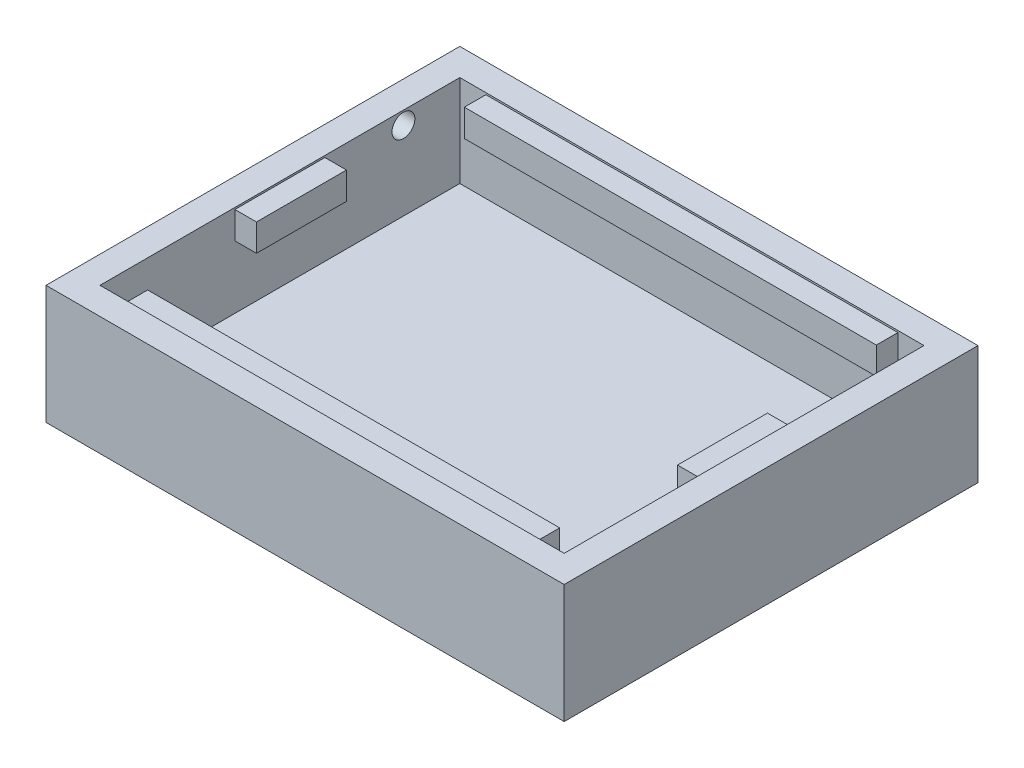
ISO-10303-21;
HEADER;
FILE_DESCRIPTION(('STEP AP214'),'2;1');
FILE_NAME('part.step','',(''),(''),'','','');
FILE_SCHEMA(('AUTOMOTIVE_DESIGN { 1 0 10303 214 1 1 1 1 }'));
ENDSEC;
DATA;
#1=APPLICATION_CONTEXT('core data for automotive mechanical design processes');
#2=APPLICATION_PROTOCOL_DEFINITION('international standard','automotive_design',2000,#1);
#3=PRODUCT_CONTEXT('',#1,'mechanical');
#4=PRODUCT('Part','Part','',(#3));
#5=PRODUCT_RELATED_PRODUCT_CATEGORY('part','',(#4));
#6=PRODUCT_DEFINITION_FORMATION('','',#4);
#7=PRODUCT_DEFINITION_CONTEXT('part definition',#1,'design');
#8=PRODUCT_DEFINITION('design','',#6,#7);
#9=PRODUCT_DEFINITION_SHAPE('','',#8);
#10=(LENGTH_UNIT() NAMED_UNIT(*) SI_UNIT(.MILLI.,.METRE.));
#11=(NAMED_UNIT(*) PLANE_ANGLE_UNIT() SI_UNIT($,.RADIAN.));
#12=(NAMED_UNIT(*) SI_UNIT($,.STERADIAN.) SOLID_ANGLE_UNIT());
#13=UNCERTAINTY_MEASURE_WITH_UNIT(LENGTH_MEASURE(1.E-05),#10,'distance_accuracy_value','');
#14=(GEOMETRIC_REPRESENTATION_CONTEXT(3) GLOBAL_UNCERTAINTY_ASSIGNED_CONTEXT((#13)) GLOBAL_UNIT_ASSIGNED_CONTEXT((#10,
#11,#12)) REPRESENTATION_CONTEXT('',''));
#15=CARTESIAN_POINT('',(0.,0.,0.));
#16=DIRECTION('',(0.,0.,1.));
#17=DIRECTION('',(1.,0.,0.));
#18=AXIS2_PLACEMENT_3D('',#15,#16,#17);
#19=CARTESIAN_POINT('',(0.,51.,0.));
#20=DIRECTION('',(1.,0.,0.));
#21=DIRECTION('',(0.,0.,-1.));
#22=AXIS2_PLACEMENT_3D('',#19,#20,#21);
#23=PLANE('',#22);
#24=CARTESIAN_POINT('',(0.,43.65,-168.65));
#25=DIRECTION('',(1.,0.,0.));
#26=DIRECTION('',(0.,0.,-1.));
#27=AXIS2_PLACEMENT_3D('',#24,#25,#26);
#28=CIRCLE('',#27,6.35);
#29=CARTESIAN_POINT('',(0.,43.65,-175.));
#30=VERTEX_POINT('',#29);
#31=EDGE_CURVE('E715',#30,#30,#28,.T.);
#32=ORIENTED_EDGE('',*,*,#31,.F.);
#33=EDGE_LOOP('',(#32));
#34=FACE_BOUND('',#33,.T.);
#35=DIRECTION('',(0.,0.,1.));
#36=VECTOR('',#35,1.);
#37=CARTESIAN_POINT('',(0.,0.,0.));
#38=LINE('',#37,#36);
#39=CARTESIAN_POINT('',(0.,0.,-200.));
#40=VERTEX_POINT('',#39);
#41=CARTESIAN_POINT('',(0.,0.,0.));
#42=VERTEX_POINT('',#41);
#43=EDGE_CURVE('E331',#40,#42,#38,.T.);
#44=ORIENTED_EDGE('',*,*,#43,.F.);
#45=DIRECTION('',(0.,-1.,0.));
#46=VECTOR('',#45,1.);
#47=CARTESIAN_POINT('',(0.,51.,-200.));
#48=LINE('',#47,#46);
#49=CARTESIAN_POINT('',(0.,51.,-200.));
#50=VERTEX_POINT('',#49);
#51=EDGE_CURVE('E342',#50,#40,#48,.T.);
#52=ORIENTED_EDGE('',*,*,#51,.F.);
#53=DIRECTION('',(0.,0.,1.));
#54=VECTOR('',#53,1.);
#55=CARTESIAN_POINT('',(0.,51.,0.));
#56=LINE('',#55,#54);
#57=CARTESIAN_POINT('',(0.,51.,0.));
#58=VERTEX_POINT('',#57);
#59=EDGE_CURVE('E332',#50,#58,#56,.T.);
#60=ORIENTED_EDGE('',*,*,#59,.T.);
#61=DIRECTION('',(0.,-1.,0.));
#62=VECTOR('',#61,1.);
#63=CARTESIAN_POINT('',(0.,51.,0.));
#64=LINE('',#63,#62);
#65=EDGE_CURVE('E360',#58,#42,#64,.T.);
#66=ORIENTED_EDGE('',*,*,#65,.T.);
#67=EDGE_LOOP('',(#44,#52,#60,#66));
#68=FACE_BOUND('',#67,.T.);
#69=DIRECTION('',(0.,0.,1.));
#70=VECTOR('',#69,1.);
#71=CARTESIAN_POINT('',(0.,50.,-125.));
#72=LINE('',#71,#70);
#73=CARTESIAN_POINT('',(0.,50.,-125.));
#74=VERTEX_POINT('',#73);
#75=CARTESIAN_POINT('',(0.,50.,-75.));
#76=VERTEX_POINT('',#75);
#77=EDGE_CURVE('E51',#74,#76,#72,.T.);
#78=ORIENTED_EDGE('',*,*,#77,.F.);
#79=DIRECTION('',(0.,1.,0.));
#80=VECTOR('',#79,1.);
#81=CARTESIAN_POINT('',(0.,50.,-125.));
#82=LINE('',#81,#80);
#83=CARTESIAN_POINT('',(0.,34.9,-125.));
#84=VERTEX_POINT('',#83);
#85=EDGE_CURVE('E56',#84,#74,#82,.T.);
#86=ORIENTED_EDGE('',*,*,#85,.F.);
#87=DIRECTION('',(0.,0.,1.));
#88=VECTOR('',#87,1.);
#89=CARTESIAN_POINT('',(0.,34.9,-125.));
#90=LINE('',#89,#88);
#91=CARTESIAN_POINT('',(0.,34.9,-75.));
#92=VERTEX_POINT('',#91);
#93=EDGE_CURVE('E215',#84,#92,#90,.T.);
#94=ORIENTED_EDGE('',*,*,#93,.T.);
#95=DIRECTION('',(0.,1.,0.));
#96=VECTOR('',#95,1.);
#97=CARTESIAN_POINT('',(0.,50.,-75.));
#98=LINE('',#97,#96);
#99=EDGE_CURVE('E219',#92,#76,#98,.T.);
#100=ORIENTED_EDGE('',*,*,#99,.T.);
#101=EDGE_LOOP('',(#78,#86,#94,#100));
#102=FACE_BOUND('',#101,.T.);
#103=ADVANCED_FACE('F36',(#34,#68,#102),#23,.T.);
#104=CARTESIAN_POINT('',(0.,51.,-200.));
#105=DIRECTION('',(0.,0.,1.));
#106=DIRECTION('',(1.,0.,0.));
#107=AXIS2_PLACEMENT_3D('',#104,#105,#106);
#108=PLANE('',#107);
#109=DIRECTION('',(-1.,0.,0.));
#110=VECTOR('',#109,1.);
#111=CARTESIAN_POINT('',(0.,0.,-200.));
#112=LINE('',#111,#110);
#113=CARTESIAN_POINT('',(258.,0.,-200.));
#114=VERTEX_POINT('',#113);
#115=EDGE_CURVE('E335',#114,#40,#112,.T.);
#116=ORIENTED_EDGE('',*,*,#115,.F.);
#117=DIRECTION('',(0.,-1.,0.));
#118=VECTOR('',#117,1.);
#119=CARTESIAN_POINT('',(258.,51.,-200.));
#120=LINE('',#119,#118);
#121=CARTESIAN_POINT('',(258.,51.,-200.));
#122=VERTEX_POINT('',#121);
#123=EDGE_CURVE('E355',#122,#114,#120,.T.);
#124=ORIENTED_EDGE('',*,*,#123,.F.);
#125=DIRECTION('',(-1.,0.,0.));
#126=VECTOR('',#125,1.);
#127=CARTESIAN_POINT('',(0.,51.,-200.));
#128=LINE('',#127,#126);
#129=EDGE_CURVE('E340',#122,#50,#128,.T.);
#130=ORIENTED_EDGE('',*,*,#129,.T.);
#131=ORIENTED_EDGE('',*,*,#51,.T.);
#132=EDGE_LOOP('',(#116,#124,#130,#131));
#133=FACE_BOUND('',#132,.T.);
#134=DIRECTION('',(-1.,0.,0.));
#135=VECTOR('',#134,1.);
#136=CARTESIAN_POINT('',(243.5,50.,-200.));
#137=LINE('',#136,#135);
#138=CARTESIAN_POINT('',(243.5,50.,-200.));
#139=VERTEX_POINT('',#138);
#140=CARTESIAN_POINT('',(14.4999999999999,50.,-200.));
#141=VERTEX_POINT('',#140);
#142=EDGE_CURVE('E287',#139,#141,#137,.T.);
#143=ORIENTED_EDGE('',*,*,#142,.F.);
#144=DIRECTION('',(0.,1.,0.));
#145=VECTOR('',#144,1.);
#146=CARTESIAN_POINT('',(243.5,50.,-200.));
#147=LINE('',#146,#145);
#148=CARTESIAN_POINT('',(243.5,34.9,-200.));
#149=VERTEX_POINT('',#148);
#150=EDGE_CURVE('E261',#149,#139,#147,.T.);
#151=ORIENTED_EDGE('',*,*,#150,.F.);
#152=DIRECTION('',(-1.,0.,0.));
#153=VECTOR('',#152,1.);
#154=CARTESIAN_POINT('',(243.5,34.9,-200.));
#155=LINE('',#154,#153);
#156=CARTESIAN_POINT('',(14.4999999999999,34.9,-200.));
#157=VERTEX_POINT('',#156);
#158=EDGE_CURVE('E272',#149,#157,#155,.T.);
#159=ORIENTED_EDGE('',*,*,#158,.T.);
#160=DIRECTION('',(0.,1.,0.));
#161=VECTOR('',#160,1.);
#162=CARTESIAN_POINT('',(14.4999999999999,50.,-200.));
#163=LINE('',#162,#161);
#164=EDGE_CURVE('E260',#157,#141,#163,.T.);
#165=ORIENTED_EDGE('',*,*,#164,.T.);
#166=EDGE_LOOP('',(#143,#151,#159,#165));
#167=FACE_BOUND('',#166,.T.);
#168=ADVANCED_FACE('F404',(#133,#167),#108,.T.);
#169=CARTESIAN_POINT('',(0.,51.,0.));
#170=DIRECTION('',(0.,-1.,0.));
#171=DIRECTION('',(0.,0.,-1.));
#172=AXIS2_PLACEMENT_3D('',#169,#170,#171);
#173=PLANE('',#172);
#174=DIRECTION('',(0.,0.,1.));
#175=VECTOR('',#174,1.);
#176=CARTESIAN_POINT('',(-15.,51.,15.));
#177=LINE('',#176,#175);
#178=CARTESIAN_POINT('',(-15.,51.,-215.));
#179=VERTEX_POINT('',#178);
#180=CARTESIAN_POINT('',(-15.,51.,15.));
#181=VERTEX_POINT('',#180);
#182=EDGE_CURVE('E363',#179,#181,#177,.T.);
#183=ORIENTED_EDGE('',*,*,#182,.T.);
#184=DIRECTION('',(1.,0.,0.));
#185=VECTOR('',#184,1.);
#186=CARTESIAN_POINT('',(-15.,51.,15.));
#187=LINE('',#186,#185);
#188=CARTESIAN_POINT('',(273.,51.,15.));
#189=VERTEX_POINT('',#188);
#190=EDGE_CURVE('E366',#181,#189,#187,.T.);
#191=ORIENTED_EDGE('',*,*,#190,.T.);
#192=DIRECTION('',(0.,0.,-1.));
#193=VECTOR('',#192,1.);
#194=CARTESIAN_POINT('',(273.,51.,15.));
#195=LINE('',#194,#193);
#196=CARTESIAN_POINT('',(273.,51.,-215.));
#197=VERTEX_POINT('',#196);
#198=EDGE_CURVE('E368',#189,#197,#195,.T.);
#199=ORIENTED_EDGE('',*,*,#198,.T.);
#200=DIRECTION('',(-1.,0.,0.));
#201=VECTOR('',#200,1.);
#202=CARTESIAN_POINT('',(-15.,51.,-215.));
#203=LINE('',#202,#201);
#204=EDGE_CURVE('E370',#197,#179,#203,.T.);
#205=ORIENTED_EDGE('',*,*,#204,.T.);
#206=EDGE_LOOP('',(#183,#191,#199,#205));
#207=FACE_BOUND('',#206,.T.);
#208=ORIENTED_EDGE('',*,*,#59,.F.);
#209=ORIENTED_EDGE('',*,*,#129,.F.);
#210=DIRECTION('',(0.,0.,-1.));
#211=VECTOR('',#210,1.);
#212=CARTESIAN_POINT('',(258.,51.,0.));
#213=LINE('',#212,#211);
#214=CARTESIAN_POINT('',(258.,51.,0.));
#215=VERTEX_POINT('',#214);
#216=EDGE_CURVE('E337',#215,#122,#213,.T.);
#217=ORIENTED_EDGE('',*,*,#216,.F.);
#218=DIRECTION('',(1.,0.,0.));
#219=VECTOR('',#218,1.);
#220=CARTESIAN_POINT('',(0.,51.,0.));
#221=LINE('',#220,#219);
#222=EDGE_CURVE('E334',#58,#215,#221,.T.);
#223=ORIENTED_EDGE('',*,*,#222,.F.);
#224=EDGE_LOOP('',(#208,#209,#217,#223));
#225=FACE_BOUND('',#224,.T.);
#226=ADVANCED_FACE('F395',(#207,#225),#173,.F.);
#227=CARTESIAN_POINT('',(-15.,51.,15.));
#228=DIRECTION('',(1.,0.,0.));
#229=DIRECTION('',(0.,0.,-1.));
#230=AXIS2_PLACEMENT_3D('',#227,#228,#229);
#231=PLANE('',#230);
#232=CARTESIAN_POINT('',(-15.,43.65,-168.65));
#233=DIRECTION('',(1.,0.,0.));
#234=DIRECTION('',(0.,0.,-1.));
#235=AXIS2_PLACEMENT_3D('',#232,#233,#234);
#236=CIRCLE('',#235,6.35);
#237=CARTESIAN_POINT('',(-15.,43.65,-175.));
#238=VERTEX_POINT('',#237);
#239=EDGE_CURVE('E221',#238,#238,#236,.F.);
#240=ORIENTED_EDGE('',*,*,#239,.F.);
#241=EDGE_LOOP('',(#240));
#242=FACE_BOUND('',#241,.T.);
#243=DIRECTION('',(0.,-1.,0.));
#244=VECTOR('',#243,1.);
#245=CARTESIAN_POINT('',(-15.,51.,-215.));
#246=LINE('',#245,#244);
#247=CARTESIAN_POINT('',(-15.,-15.,-215.));
#248=VERTEX_POINT('',#247);
#249=EDGE_CURVE('E372',#179,#248,#246,.T.);
#250=ORIENTED_EDGE('',*,*,#249,.T.);
#251=DIRECTION('',(0.,0.,-1.));
#252=VECTOR('',#251,1.);
#253=CARTESIAN_POINT('',(-15.,-15.,-215.));
#254=LINE('',#253,#252);
#255=CARTESIAN_POINT('',(-15.,-15.,15.));
#256=VERTEX_POINT('',#255);
#257=EDGE_CURVE('E325',#256,#248,#254,.T.);
#258=ORIENTED_EDGE('',*,*,#257,.F.);
#259=DIRECTION('',(0.,-1.,0.));
#260=VECTOR('',#259,1.);
#261=CARTESIAN_POINT('',(-15.,51.,15.));
#262=LINE('',#261,#260);
#263=EDGE_CURVE('E11',#181,#256,#262,.T.);
#264=ORIENTED_EDGE('',*,*,#263,.F.);
#265=ORIENTED_EDGE('',*,*,#182,.F.);
#266=EDGE_LOOP('',(#250,#258,#264,#265));
#267=FACE_BOUND('',#266,.T.);
#268=ADVANCED_FACE('F38',(#242,#267),#231,.F.);
#269=CARTESIAN_POINT('',(-15.,51.,15.));
#270=DIRECTION('',(0.,0.,-1.));
#271=DIRECTION('',(-1.,0.,0.));
#272=AXIS2_PLACEMENT_3D('',#269,#270,#271);
#273=PLANE('',#272);
#274=ORIENTED_EDGE('',*,*,#263,.T.);
#275=DIRECTION('',(-1.,0.,0.));
#276=VECTOR('',#275,1.);
#277=CARTESIAN_POINT('',(-15.,-15.,15.));
#278=LINE('',#277,#276);
#279=CARTESIAN_POINT('',(273.,-15.,15.));
#280=VERTEX_POINT('',#279);
#281=EDGE_CURVE('E322',#280,#256,#278,.T.);
#282=ORIENTED_EDGE('',*,*,#281,.F.);
#283=DIRECTION('',(0.,-1.,0.));
#284=VECTOR('',#283,1.);
#285=CARTESIAN_POINT('',(273.,51.,15.));
#286=LINE('',#285,#284);
#287=EDGE_CURVE('E44',#189,#280,#286,.T.);
#288=ORIENTED_EDGE('',*,*,#287,.F.);
#289=ORIENTED_EDGE('',*,*,#190,.F.);
#290=EDGE_LOOP('',(#274,#282,#288,#289));
#291=FACE_BOUND('',#290,.T.);
#292=ADVANCED_FACE('F383',(#291),#273,.F.);
#293=CARTESIAN_POINT('',(273.,51.,15.));
#294=DIRECTION('',(-1.,0.,0.));
#295=DIRECTION('',(0.,0.,1.));
#296=AXIS2_PLACEMENT_3D('',#293,#294,#295);
#297=PLANE('',#296);
#298=ORIENTED_EDGE('',*,*,#287,.T.);
#299=DIRECTION('',(0.,0.,1.));
#300=VECTOR('',#299,1.);
#301=CARTESIAN_POINT('',(273.,-15.,15.));
#302=LINE('',#301,#300);
#303=CARTESIAN_POINT('',(273.,-15.,-215.));
#304=VERTEX_POINT('',#303);
#305=EDGE_CURVE('E319',#304,#280,#302,.T.);
#306=ORIENTED_EDGE('',*,*,#305,.F.);
#307=DIRECTION('',(0.,-1.,0.));
#308=VECTOR('',#307,1.);
#309=CARTESIAN_POINT('',(273.,51.,-215.));
#310=LINE('',#309,#308);
#311=EDGE_CURVE('E374',#197,#304,#310,.T.);
#312=ORIENTED_EDGE('',*,*,#311,.F.);
#313=ORIENTED_EDGE('',*,*,#198,.F.);
#314=EDGE_LOOP('',(#298,#306,#312,#313));
#315=FACE_BOUND('',#314,.T.);
#316=ADVANCED_FACE('F380',(#315),#297,.F.);
#317=CARTESIAN_POINT('',(-15.,51.,-215.));
#318=DIRECTION('',(0.,0.,1.));
#319=DIRECTION('',(1.,0.,0.));
#320=AXIS2_PLACEMENT_3D('',#317,#318,#319);
#321=PLANE('',#320);
#322=ORIENTED_EDGE('',*,*,#311,.T.);
#323=DIRECTION('',(1.,0.,0.));
#324=VECTOR('',#323,1.);
#325=CARTESIAN_POINT('',(273.,-15.,-215.));
#326=LINE('',#325,#324);
#327=EDGE_CURVE('E328',#248,#304,#326,.T.);
#328=ORIENTED_EDGE('',*,*,#327,.F.);
#329=ORIENTED_EDGE('',*,*,#249,.F.);
#330=ORIENTED_EDGE('',*,*,#204,.F.);
#331=EDGE_LOOP('',(#322,#328,#329,#330));
#332=FACE_BOUND('',#331,.T.);
#333=ADVANCED_FACE('F391',(#332),#321,.F.);
#334=CARTESIAN_POINT('',(0.,51.,0.));
#335=DIRECTION('',(0.,0.,-1.));
#336=DIRECTION('',(-1.,0.,0.));
#337=AXIS2_PLACEMENT_3D('',#334,#335,#336);
#338=PLANE('',#337);
#339=DIRECTION('',(0.,-1.,0.));
#340=VECTOR('',#339,1.);
#341=CARTESIAN_POINT('',(243.5,50.,0.));
#342=LINE('',#341,#340);
#343=CARTESIAN_POINT('',(243.5,50.,0.));
#344=VERTEX_POINT('',#343);
#345=CARTESIAN_POINT('',(243.5,34.9,0.));
#346=VERTEX_POINT('',#345);
#347=EDGE_CURVE('E291',#344,#346,#342,.T.);
#348=ORIENTED_EDGE('',*,*,#347,.F.);
#349=DIRECTION('',(-1.,0.,0.));
#350=VECTOR('',#349,1.);
#351=CARTESIAN_POINT('',(243.5,50.,0.));
#352=LINE('',#351,#350);
#353=CARTESIAN_POINT('',(14.5,50.,0.));
#354=VERTEX_POINT('',#353);
#355=EDGE_CURVE('E301',#344,#354,#352,.T.);
#356=ORIENTED_EDGE('',*,*,#355,.T.);
#357=DIRECTION('',(0.,-1.,0.));
#358=VECTOR('',#357,1.);
#359=CARTESIAN_POINT('',(14.5,50.,0.));
#360=LINE('',#359,#358);
#361=CARTESIAN_POINT('',(14.5,34.9,0.));
#362=VERTEX_POINT('',#361);
#363=EDGE_CURVE('E290',#354,#362,#360,.T.);
#364=ORIENTED_EDGE('',*,*,#363,.T.);
#365=DIRECTION('',(-1.,0.,0.));
#366=VECTOR('',#365,1.);
#367=CARTESIAN_POINT('',(243.5,34.9,0.));
#368=LINE('',#367,#366);
#369=EDGE_CURVE('E317',#346,#362,#368,.T.);
#370=ORIENTED_EDGE('',*,*,#369,.F.);
#371=EDGE_LOOP('',(#348,#356,#364,#370));
#372=FACE_BOUND('',#371,.T.);
#373=DIRECTION('',(1.,0.,0.));
#374=VECTOR('',#373,1.);
#375=CARTESIAN_POINT('',(0.,0.,0.));
#376=LINE('',#375,#374);
#377=CARTESIAN_POINT('',(258.,0.,0.));
#378=VERTEX_POINT('',#377);
#379=EDGE_CURVE('E345',#42,#378,#376,.T.);
#380=ORIENTED_EDGE('',*,*,#379,.F.);
#381=ORIENTED_EDGE('',*,*,#65,.F.);
#382=ORIENTED_EDGE('',*,*,#222,.T.);
#383=DIRECTION('',(0.,-1.,0.));
#384=VECTOR('',#383,1.);
#385=CARTESIAN_POINT('',(258.,51.,0.));
#386=LINE('',#385,#384);
#387=EDGE_CURVE('E358',#215,#378,#386,.T.);
#388=ORIENTED_EDGE('',*,*,#387,.T.);
#389=EDGE_LOOP('',(#380,#381,#382,#388));
#390=FACE_BOUND('',#389,.T.);
#391=ADVANCED_FACE('F418',(#372,#390),#338,.T.);
#392=CARTESIAN_POINT('',(258.,51.,0.));
#393=DIRECTION('',(-1.,0.,0.));
#394=DIRECTION('',(0.,0.,1.));
#395=AXIS2_PLACEMENT_3D('',#392,#393,#394);
#396=PLANE('',#395);
#397=DIRECTION('',(0.,-1.,0.));
#398=VECTOR('',#397,1.);
#399=CARTESIAN_POINT('',(258.,50.,-125.));
#400=LINE('',#399,#398);
#401=CARTESIAN_POINT('',(258.,50.,-125.));
#402=VERTEX_POINT('',#401);
#403=CARTESIAN_POINT('',(258.,34.9,-125.));
#404=VERTEX_POINT('',#403);
#405=EDGE_CURVE('E232',#402,#404,#400,.T.);
#406=ORIENTED_EDGE('',*,*,#405,.F.);
#407=DIRECTION('',(0.,0.,1.));
#408=VECTOR('',#407,1.);
#409=CARTESIAN_POINT('',(258.,50.,-125.));
#410=LINE('',#409,#408);
#411=CARTESIAN_POINT('',(258.,50.,-75.));
#412=VERTEX_POINT('',#411);
#413=EDGE_CURVE('E242',#402,#412,#410,.T.);
#414=ORIENTED_EDGE('',*,*,#413,.T.);
#415=DIRECTION('',(0.,-1.,0.));
#416=VECTOR('',#415,1.);
#417=CARTESIAN_POINT('',(258.,50.,-75.));
#418=LINE('',#417,#416);
#419=CARTESIAN_POINT('',(258.,34.9,-75.));
#420=VERTEX_POINT('',#419);
#421=EDGE_CURVE('E231',#412,#420,#418,.T.);
#422=ORIENTED_EDGE('',*,*,#421,.T.);
#423=DIRECTION('',(0.,0.,1.));
#424=VECTOR('',#423,1.);
#425=CARTESIAN_POINT('',(258.,34.9,-125.));
#426=LINE('',#425,#424);
#427=EDGE_CURVE('E258',#404,#420,#426,.T.);
#428=ORIENTED_EDGE('',*,*,#427,.F.);
#429=EDGE_LOOP('',(#406,#414,#422,#428));
#430=FACE_BOUND('',#429,.T.);
#431=DIRECTION('',(0.,0.,-1.));
#432=VECTOR('',#431,1.);
#433=CARTESIAN_POINT('',(258.,0.,0.));
#434=LINE('',#433,#432);
#435=EDGE_CURVE('E348',#378,#114,#434,.T.);
#436=ORIENTED_EDGE('',*,*,#435,.F.);
#437=ORIENTED_EDGE('',*,*,#387,.F.);
#438=ORIENTED_EDGE('',*,*,#216,.T.);
#439=ORIENTED_EDGE('',*,*,#123,.T.);
#440=EDGE_LOOP('',(#436,#437,#438,#439));
#441=FACE_BOUND('',#440,.T.);
#442=ADVANCED_FACE('F439',(#430,#441),#396,.T.);
#443=CARTESIAN_POINT('',(0.,0.,0.));
#444=DIRECTION('',(0.,1.,0.));
#445=DIRECTION('',(0.,0.,1.));
#446=AXIS2_PLACEMENT_3D('',#443,#444,#445);
#447=PLANE('',#446);
#448=ORIENTED_EDGE('',*,*,#435,.T.);
#449=ORIENTED_EDGE('',*,*,#115,.T.);
#450=ORIENTED_EDGE('',*,*,#43,.T.);
#451=ORIENTED_EDGE('',*,*,#379,.T.);
#452=EDGE_LOOP('',(#448,#449,#450,#451));
#453=FACE_BOUND('',#452,.T.);
#454=ADVANCED_FACE('F448',(#453),#447,.T.);
#455=CARTESIAN_POINT('',(0.,-15.,0.));
#456=DIRECTION('',(0.,1.,0.));
#457=DIRECTION('',(0.,0.,1.));
#458=AXIS2_PLACEMENT_3D('',#455,#456,#457);
#459=PLANE('',#458);
#460=ORIENTED_EDGE('',*,*,#305,.T.);
#461=ORIENTED_EDGE('',*,*,#281,.T.);
#462=ORIENTED_EDGE('',*,*,#257,.T.);
#463=ORIENTED_EDGE('',*,*,#327,.T.);
#464=EDGE_LOOP('',(#460,#461,#462,#463));
#465=FACE_BOUND('',#464,.T.);
#466=ADVANCED_FACE('F387',(#465),#459,.F.);
#467=CARTESIAN_POINT('',(243.5,34.9,0.));
#468=DIRECTION('',(0.,1.,0.));
#469=DIRECTION('',(0.,0.,1.));
#470=AXIS2_PLACEMENT_3D('',#467,#468,#469);
#471=PLANE('',#470);
#472=DIRECTION('',(0.,0.,-1.));
#473=VECTOR('',#472,1.);
#474=CARTESIAN_POINT('',(14.5,34.9,0.));
#475=LINE('',#474,#473);
#476=CARTESIAN_POINT('',(14.5,34.9,-12.));
#477=VERTEX_POINT('',#476);
#478=EDGE_CURVE('E304',#362,#477,#475,.T.);
#479=ORIENTED_EDGE('',*,*,#478,.T.);
#480=DIRECTION('',(-1.,0.,0.));
#481=VECTOR('',#480,1.);
#482=CARTESIAN_POINT('',(243.5,34.9,-12.0000000000001));
#483=LINE('',#482,#481);
#484=CARTESIAN_POINT('',(243.5,34.9,-12.0000000000001));
#485=VERTEX_POINT('',#484);
#486=EDGE_CURVE('E314',#485,#477,#483,.T.);
#487=ORIENTED_EDGE('',*,*,#486,.F.);
#488=DIRECTION('',(0.,0.,-1.));
#489=VECTOR('',#488,1.);
#490=CARTESIAN_POINT('',(243.5,34.9,0.));
#491=LINE('',#490,#489);
#492=EDGE_CURVE('E294',#346,#485,#491,.T.);
#493=ORIENTED_EDGE('',*,*,#492,.F.);
#494=ORIENTED_EDGE('',*,*,#369,.T.);
#495=EDGE_LOOP('',(#479,#487,#493,#494));
#496=FACE_BOUND('',#495,.T.);
#497=ADVANCED_FACE('F463',(#496),#471,.F.);
#498=CARTESIAN_POINT('',(243.5,50.,-12.0000000000001));
#499=DIRECTION('',(0.,0.,1.));
#500=DIRECTION('',(0.,-1.,0.));
#501=AXIS2_PLACEMENT_3D('',#498,#499,#500);
#502=PLANE('',#501);
#503=DIRECTION('',(0.,1.,0.));
#504=VECTOR('',#503,1.);
#505=CARTESIAN_POINT('',(14.5,50.,-12.));
#506=LINE('',#505,#504);
#507=CARTESIAN_POINT('',(14.5,50.,-12.));
#508=VERTEX_POINT('',#507);
#509=EDGE_CURVE('E306',#477,#508,#506,.T.);
#510=ORIENTED_EDGE('',*,*,#509,.T.);
#511=DIRECTION('',(-1.,0.,0.));
#512=VECTOR('',#511,1.);
#513=CARTESIAN_POINT('',(243.5,50.,-12.0000000000001));
#514=LINE('',#513,#512);
#515=CARTESIAN_POINT('',(243.5,50.,-12.0000000000001));
#516=VERTEX_POINT('',#515);
#517=EDGE_CURVE('E311',#516,#508,#514,.T.);
#518=ORIENTED_EDGE('',*,*,#517,.F.);
#519=DIRECTION('',(0.,1.,0.));
#520=VECTOR('',#519,1.);
#521=CARTESIAN_POINT('',(243.5,50.,-12.0000000000001));
#522=LINE('',#521,#520);
#523=EDGE_CURVE('E297',#485,#516,#522,.T.);
#524=ORIENTED_EDGE('',*,*,#523,.F.);
#525=ORIENTED_EDGE('',*,*,#486,.T.);
#526=EDGE_LOOP('',(#510,#518,#524,#525));
#527=FACE_BOUND('',#526,.T.);
#528=ADVANCED_FACE('F469',(#527),#502,.F.);
#529=CARTESIAN_POINT('',(243.5,50.,0.));
#530=DIRECTION('',(0.,-1.,0.));
#531=DIRECTION('',(0.,0.,-1.));
#532=AXIS2_PLACEMENT_3D('',#529,#530,#531);
#533=PLANE('',#532);
#534=DIRECTION('',(0.,0.,1.));
#535=VECTOR('',#534,1.);
#536=CARTESIAN_POINT('',(14.5,50.,0.));
#537=LINE('',#536,#535);
#538=EDGE_CURVE('E295',#508,#354,#537,.T.);
#539=ORIENTED_EDGE('',*,*,#538,.T.);
#540=ORIENTED_EDGE('',*,*,#355,.F.);
#541=DIRECTION('',(0.,0.,1.));
#542=VECTOR('',#541,1.);
#543=CARTESIAN_POINT('',(243.5,50.,0.));
#544=LINE('',#543,#542);
#545=EDGE_CURVE('E299',#516,#344,#544,.T.);
#546=ORIENTED_EDGE('',*,*,#545,.F.);
#547=ORIENTED_EDGE('',*,*,#517,.T.);
#548=EDGE_LOOP('',(#539,#540,#546,#547));
#549=FACE_BOUND('',#548,.T.);
#550=ADVANCED_FACE('F477',(#549),#533,.F.);
#551=CARTESIAN_POINT('',(243.5,0.,0.));
#552=DIRECTION('',(1.,0.,0.));
#553=DIRECTION('',(0.,0.,-1.));
#554=AXIS2_PLACEMENT_3D('',#551,#552,#553);
#555=PLANE('',#554);
#556=ORIENTED_EDGE('',*,*,#347,.T.);
#557=ORIENTED_EDGE('',*,*,#492,.T.);
#558=ORIENTED_EDGE('',*,*,#523,.T.);
#559=ORIENTED_EDGE('',*,*,#545,.T.);
#560=EDGE_LOOP('',(#556,#557,#558,#559));
#561=FACE_BOUND('',#560,.T.);
#562=ADVANCED_FACE('F485',(#561),#555,.T.);
#563=CARTESIAN_POINT('',(14.5,0.,0.));
#564=DIRECTION('',(1.,0.,0.));
#565=DIRECTION('',(0.,0.,-1.));
#566=AXIS2_PLACEMENT_3D('',#563,#564,#565);
#567=PLANE('',#566);
#568=ORIENTED_EDGE('',*,*,#363,.F.);
#569=ORIENTED_EDGE('',*,*,#538,.F.);
#570=ORIENTED_EDGE('',*,*,#509,.F.);
#571=ORIENTED_EDGE('',*,*,#478,.F.);
#572=EDGE_LOOP('',(#568,#569,#570,#571));
#573=FACE_BOUND('',#572,.T.);
#574=ADVANCED_FACE('F493',(#573),#567,.F.);
#575=CARTESIAN_POINT('',(243.5,50.,-200.));
#576=DIRECTION('',(0.,-1.,0.));
#577=DIRECTION('',(0.,0.,-1.));
#578=AXIS2_PLACEMENT_3D('',#575,#576,#577);
#579=PLANE('',#578);
#580=DIRECTION('',(0.,0.,1.));
#581=VECTOR('',#580,1.);
#582=CARTESIAN_POINT('',(14.4999999999999,50.,-200.));
#583=LINE('',#582,#581);
#584=CARTESIAN_POINT('',(14.4999999999999,50.,-188.));
#585=VERTEX_POINT('',#584);
#586=EDGE_CURVE('E274',#141,#585,#583,.T.);
#587=ORIENTED_EDGE('',*,*,#586,.T.);
#588=DIRECTION('',(-1.,0.,0.));
#589=VECTOR('',#588,1.);
#590=CARTESIAN_POINT('',(243.5,50.,-188.));
#591=LINE('',#590,#589);
#592=CARTESIAN_POINT('',(243.5,50.,-188.));
#593=VERTEX_POINT('',#592);
#594=EDGE_CURVE('E284',#593,#585,#591,.T.);
#595=ORIENTED_EDGE('',*,*,#594,.F.);
#596=DIRECTION('',(0.,0.,1.));
#597=VECTOR('',#596,1.);
#598=CARTESIAN_POINT('',(243.5,50.,-200.));
#599=LINE('',#598,#597);
#600=EDGE_CURVE('E264',#139,#593,#599,.T.);
#601=ORIENTED_EDGE('',*,*,#600,.F.);
#602=ORIENTED_EDGE('',*,*,#142,.T.);
#603=EDGE_LOOP('',(#587,#595,#601,#602));
#604=FACE_BOUND('',#603,.T.);
#605=ADVANCED_FACE('F501',(#604),#579,.F.);
#606=CARTESIAN_POINT('',(243.5,50.,-188.));
#607=DIRECTION('',(0.,0.,-1.));
#608=DIRECTION('',(-1.,0.,0.));
#609=AXIS2_PLACEMENT_3D('',#606,#607,#608);
#610=PLANE('',#609);
#611=DIRECTION('',(0.,-1.,0.));
#612=VECTOR('',#611,1.);
#613=CARTESIAN_POINT('',(14.4999999999999,50.,-188.));
#614=LINE('',#613,#612);
#615=CARTESIAN_POINT('',(14.4999999999999,34.9,-188.));
#616=VERTEX_POINT('',#615);
#617=EDGE_CURVE('E276',#585,#616,#614,.T.);
#618=ORIENTED_EDGE('',*,*,#617,.T.);
#619=DIRECTION('',(-1.,0.,0.));
#620=VECTOR('',#619,1.);
#621=CARTESIAN_POINT('',(243.5,34.9,-188.));
#622=LINE('',#621,#620);
#623=CARTESIAN_POINT('',(243.5,34.9,-188.));
#624=VERTEX_POINT('',#623);
#625=EDGE_CURVE('E281',#624,#616,#622,.T.);
#626=ORIENTED_EDGE('',*,*,#625,.F.);
#627=DIRECTION('',(0.,-1.,0.));
#628=VECTOR('',#627,1.);
#629=CARTESIAN_POINT('',(243.5,50.,-188.));
#630=LINE('',#629,#628);
#631=EDGE_CURVE('E267',#593,#624,#630,.T.);
#632=ORIENTED_EDGE('',*,*,#631,.F.);
#633=ORIENTED_EDGE('',*,*,#594,.T.);
#634=EDGE_LOOP('',(#618,#626,#632,#633));
#635=FACE_BOUND('',#634,.T.);
#636=ADVANCED_FACE('F509',(#635),#610,.F.);
#637=CARTESIAN_POINT('',(243.5,34.9,-200.));
#638=DIRECTION('',(0.,1.,0.));
#639=DIRECTION('',(0.,0.,1.));
#640=AXIS2_PLACEMENT_3D('',#637,#638,#639);
#641=PLANE('',#640);
#642=DIRECTION('',(0.,0.,-1.));
#643=VECTOR('',#642,1.);
#644=CARTESIAN_POINT('',(14.4999999999999,34.9,-200.));
#645=LINE('',#644,#643);
#646=EDGE_CURVE('E265',#616,#157,#645,.T.);
#647=ORIENTED_EDGE('',*,*,#646,.T.);
#648=ORIENTED_EDGE('',*,*,#158,.F.);
#649=DIRECTION('',(0.,0.,-1.));
#650=VECTOR('',#649,1.);
#651=CARTESIAN_POINT('',(243.5,34.9,-200.));
#652=LINE('',#651,#650);
#653=EDGE_CURVE('E269',#624,#149,#652,.T.);
#654=ORIENTED_EDGE('',*,*,#653,.F.);
#655=ORIENTED_EDGE('',*,*,#625,.T.);
#656=EDGE_LOOP('',(#647,#648,#654,#655));
#657=FACE_BOUND('',#656,.T.);
#658=ADVANCED_FACE('F517',(#657),#641,.F.);
#659=CARTESIAN_POINT('',(243.5,0.,0.));
#660=DIRECTION('',(-1.,0.,0.));
#661=DIRECTION('',(0.,0.,1.));
#662=AXIS2_PLACEMENT_3D('',#659,#660,#661);
#663=PLANE('',#662);
#664=ORIENTED_EDGE('',*,*,#150,.T.);
#665=ORIENTED_EDGE('',*,*,#600,.T.);
#666=ORIENTED_EDGE('',*,*,#631,.T.);
#667=ORIENTED_EDGE('',*,*,#653,.T.);
#668=EDGE_LOOP('',(#664,#665,#666,#667));
#669=FACE_BOUND('',#668,.T.);
#670=ADVANCED_FACE('F525',(#669),#663,.F.);
#671=CARTESIAN_POINT('',(14.4999999999999,0.,0.));
#672=DIRECTION('',(-1.,0.,0.));
#673=DIRECTION('',(0.,0.,1.));
#674=AXIS2_PLACEMENT_3D('',#671,#672,#673);
#675=PLANE('',#674);
#676=ORIENTED_EDGE('',*,*,#164,.F.);
#677=ORIENTED_EDGE('',*,*,#646,.F.);
#678=ORIENTED_EDGE('',*,*,#617,.F.);
#679=ORIENTED_EDGE('',*,*,#586,.F.);
#680=EDGE_LOOP('',(#676,#677,#678,#679));
#681=FACE_BOUND('',#680,.T.);
#682=ADVANCED_FACE('F533',(#681),#675,.T.);
#683=CARTESIAN_POINT('',(258.,34.9,-125.));
#684=DIRECTION('',(0.,1.,0.));
#685=DIRECTION('',(0.,0.,1.));
#686=AXIS2_PLACEMENT_3D('',#683,#684,#685);
#687=PLANE('',#686);
#688=DIRECTION('',(-1.,0.,0.));
#689=VECTOR('',#688,1.);
#690=CARTESIAN_POINT('',(258.,34.9,-75.));
#691=LINE('',#690,#689);
#692=CARTESIAN_POINT('',(246.,34.9,-75.));
#693=VERTEX_POINT('',#692);
#694=EDGE_CURVE('E245',#420,#693,#691,.T.);
#695=ORIENTED_EDGE('',*,*,#694,.T.);
#696=DIRECTION('',(0.,0.,1.));
#697=VECTOR('',#696,1.);
#698=CARTESIAN_POINT('',(246.,34.9,-125.));
#699=LINE('',#698,#697);
#700=CARTESIAN_POINT('',(246.,34.9,-125.));
#701=VERTEX_POINT('',#700);
#702=EDGE_CURVE('E255',#701,#693,#699,.T.);
#703=ORIENTED_EDGE('',*,*,#702,.F.);
#704=DIRECTION('',(-1.,0.,0.));
#705=VECTOR('',#704,1.);
#706=CARTESIAN_POINT('',(258.,34.9,-125.));
#707=LINE('',#706,#705);
#708=EDGE_CURVE('E235',#404,#701,#707,.T.);
#709=ORIENTED_EDGE('',*,*,#708,.F.);
#710=ORIENTED_EDGE('',*,*,#427,.T.);
#711=EDGE_LOOP('',(#695,#703,#709,#710));
#712=FACE_BOUND('',#711,.T.);
#713=ADVANCED_FACE('F540',(#712),#687,.F.);
#714=CARTESIAN_POINT('',(246.,50.,-125.));
#715=DIRECTION('',(1.,0.,0.));
#716=DIRECTION('',(0.,1.,0.));
#717=AXIS2_PLACEMENT_3D('',#714,#715,#716);
#718=PLANE('',#717);
#719=DIRECTION('',(0.,1.,0.));
#720=VECTOR('',#719,1.);
#721=CARTESIAN_POINT('',(246.,50.,-75.));
#722=LINE('',#721,#720);
#723=CARTESIAN_POINT('',(246.,50.,-75.));
#724=VERTEX_POINT('',#723);
#725=EDGE_CURVE('E247',#693,#724,#722,.T.);
#726=ORIENTED_EDGE('',*,*,#725,.T.);
#727=DIRECTION('',(0.,0.,1.));
#728=VECTOR('',#727,1.);
#729=CARTESIAN_POINT('',(246.,50.,-125.));
#730=LINE('',#729,#728);
#731=CARTESIAN_POINT('',(246.,50.,-125.));
#732=VERTEX_POINT('',#731);
#733=EDGE_CURVE('E252',#732,#724,#730,.T.);
#734=ORIENTED_EDGE('',*,*,#733,.F.);
#735=DIRECTION('',(0.,1.,0.));
#736=VECTOR('',#735,1.);
#737=CARTESIAN_POINT('',(246.,50.,-125.));
#738=LINE('',#737,#736);
#739=EDGE_CURVE('E238',#701,#732,#738,.T.);
#740=ORIENTED_EDGE('',*,*,#739,.F.);
#741=ORIENTED_EDGE('',*,*,#702,.T.);
#742=EDGE_LOOP('',(#726,#734,#740,#741));
#743=FACE_BOUND('',#742,.T.);
#744=ADVANCED_FACE('F547',(#743),#718,.F.);
#745=CARTESIAN_POINT('',(258.,50.,-125.));
#746=DIRECTION('',(0.,-1.,0.));
#747=DIRECTION('',(0.,0.,-1.));
#748=AXIS2_PLACEMENT_3D('',#745,#746,#747);
#749=PLANE('',#748);
#750=DIRECTION('',(1.,0.,0.));
#751=VECTOR('',#750,1.);
#752=CARTESIAN_POINT('',(258.,50.,-75.));
#753=LINE('',#752,#751);
#754=EDGE_CURVE('E236',#724,#412,#753,.T.);
#755=ORIENTED_EDGE('',*,*,#754,.T.);
#756=ORIENTED_EDGE('',*,*,#413,.F.);
#757=DIRECTION('',(1.,0.,0.));
#758=VECTOR('',#757,1.);
#759=CARTESIAN_POINT('',(258.,50.,-125.));
#760=LINE('',#759,#758);
#761=EDGE_CURVE('E240',#732,#402,#760,.T.);
#762=ORIENTED_EDGE('',*,*,#761,.F.);
#763=ORIENTED_EDGE('',*,*,#733,.T.);
#764=EDGE_LOOP('',(#755,#756,#762,#763));
#765=FACE_BOUND('',#764,.T.);
#766=ADVANCED_FACE('F555',(#765),#749,.F.);
#767=CARTESIAN_POINT('',(0.,0.,-125.));
#768=DIRECTION('',(0.,0.,-1.));
#769=DIRECTION('',(-1.,0.,0.));
#770=AXIS2_PLACEMENT_3D('',#767,#768,#769);
#771=PLANE('',#770);
#772=ORIENTED_EDGE('',*,*,#405,.T.);
#773=ORIENTED_EDGE('',*,*,#708,.T.);
#774=ORIENTED_EDGE('',*,*,#739,.T.);
#775=ORIENTED_EDGE('',*,*,#761,.T.);
#776=EDGE_LOOP('',(#772,#773,#774,#775));
#777=FACE_BOUND('',#776,.T.);
#778=ADVANCED_FACE('F563',(#777),#771,.T.);
#779=CARTESIAN_POINT('',(0.,0.,-75.));
#780=DIRECTION('',(0.,0.,-1.));
#781=DIRECTION('',(-1.,0.,0.));
#782=AXIS2_PLACEMENT_3D('',#779,#780,#781);
#783=PLANE('',#782);
#784=ORIENTED_EDGE('',*,*,#421,.F.);
#785=ORIENTED_EDGE('',*,*,#754,.F.);
#786=ORIENTED_EDGE('',*,*,#725,.F.);
#787=ORIENTED_EDGE('',*,*,#694,.F.);
#788=EDGE_LOOP('',(#784,#785,#786,#787));
#789=FACE_BOUND('',#788,.T.);
#790=ADVANCED_FACE('F571',(#789),#783,.F.);
#791=CARTESIAN_POINT('',(0.,50.,-125.));
#792=DIRECTION('',(0.,-1.,0.));
#793=DIRECTION('',(0.,0.,-1.));
#794=AXIS2_PLACEMENT_3D('',#791,#792,#793);
#795=PLANE('',#794);
#796=DIRECTION('',(1.,0.,0.));
#797=VECTOR('',#796,1.);
#798=CARTESIAN_POINT('',(0.,50.,-75.));
#799=LINE('',#798,#797);
#800=CARTESIAN_POINT('',(12.,50.,-75.));
#801=VERTEX_POINT('',#800);
#802=EDGE_CURVE('E205',#76,#801,#799,.T.);
#803=ORIENTED_EDGE('',*,*,#802,.T.);
#804=DIRECTION('',(0.,0.,1.));
#805=VECTOR('',#804,1.);
#806=CARTESIAN_POINT('',(12.,50.,-125.));
#807=LINE('',#806,#805);
#808=CARTESIAN_POINT('',(12.,50.,-125.));
#809=VERTEX_POINT('',#808);
#810=EDGE_CURVE('E202',#809,#801,#807,.T.);
#811=ORIENTED_EDGE('',*,*,#810,.F.);
#812=DIRECTION('',(1.,0.,0.));
#813=VECTOR('',#812,1.);
#814=CARTESIAN_POINT('',(0.,50.,-125.));
#815=LINE('',#814,#813);
#816=EDGE_CURVE('E193',#74,#809,#815,.T.);
#817=ORIENTED_EDGE('',*,*,#816,.F.);
#818=ORIENTED_EDGE('',*,*,#77,.T.);
#819=EDGE_LOOP('',(#803,#811,#817,#818));
#820=FACE_BOUND('',#819,.T.);
#821=ADVANCED_FACE('F203',(#820),#795,.F.);
#822=CARTESIAN_POINT('',(12.,50.,-125.));
#823=DIRECTION('',(-1.,0.,0.));
#824=DIRECTION('',(0.,-1.,0.));
#825=AXIS2_PLACEMENT_3D('',#822,#823,#824);
#826=PLANE('',#825);
#827=DIRECTION('',(0.,-1.,0.));
#828=VECTOR('',#827,1.);
#829=CARTESIAN_POINT('',(12.,50.,-75.));
#830=LINE('',#829,#828);
#831=CARTESIAN_POINT('',(12.,34.9,-75.));
#832=VERTEX_POINT('',#831);
#833=EDGE_CURVE('E223',#801,#832,#830,.T.);
#834=ORIENTED_EDGE('',*,*,#833,.T.);
#835=DIRECTION('',(0.,0.,1.));
#836=VECTOR('',#835,1.);
#837=CARTESIAN_POINT('',(12.,34.9,-125.));
#838=LINE('',#837,#836);
#839=CARTESIAN_POINT('',(12.,34.9,-125.));
#840=VERTEX_POINT('',#839);
#841=EDGE_CURVE('E208',#840,#832,#838,.T.);
#842=ORIENTED_EDGE('',*,*,#841,.F.);
#843=DIRECTION('',(0.,-1.,0.));
#844=VECTOR('',#843,1.);
#845=CARTESIAN_POINT('',(12.,50.,-125.));
#846=LINE('',#845,#844);
#847=EDGE_CURVE('E197',#809,#840,#846,.T.);
#848=ORIENTED_EDGE('',*,*,#847,.F.);
#849=ORIENTED_EDGE('',*,*,#810,.T.);
#850=EDGE_LOOP('',(#834,#842,#848,#849));
#851=FACE_BOUND('',#850,.T.);
#852=ADVANCED_FACE('F210',(#851),#826,.F.);
#853=CARTESIAN_POINT('',(0.,34.9,-125.));
#854=DIRECTION('',(0.,1.,0.));
#855=DIRECTION('',(0.,0.,1.));
#856=AXIS2_PLACEMENT_3D('',#853,#854,#855);
#857=PLANE('',#856);
#858=DIRECTION('',(-1.,0.,0.));
#859=VECTOR('',#858,1.);
#860=CARTESIAN_POINT('',(0.,34.9,-75.));
#861=LINE('',#860,#859);
#862=EDGE_CURVE('E225',#832,#92,#861,.T.);
#863=ORIENTED_EDGE('',*,*,#862,.T.);
#864=ORIENTED_EDGE('',*,*,#93,.F.);
#865=DIRECTION('',(-1.,0.,0.));
#866=VECTOR('',#865,1.);
#867=CARTESIAN_POINT('',(0.,34.9,-125.));
#868=LINE('',#867,#866);
#869=EDGE_CURVE('E213',#840,#84,#868,.T.);
#870=ORIENTED_EDGE('',*,*,#869,.F.);
#871=ORIENTED_EDGE('',*,*,#841,.T.);
#872=EDGE_LOOP('',(#863,#864,#870,#871));
#873=FACE_BOUND('',#872,.T.);
#874=ADVANCED_FACE('F592',(#873),#857,.F.);
#875=CARTESIAN_POINT('',(0.,0.,-125.));
#876=DIRECTION('',(0.,0.,1.));
#877=DIRECTION('',(1.,0.,0.));
#878=AXIS2_PLACEMENT_3D('',#875,#876,#877);
#879=PLANE('',#878);
#880=ORIENTED_EDGE('',*,*,#85,.T.);
#881=ORIENTED_EDGE('',*,*,#816,.T.);
#882=ORIENTED_EDGE('',*,*,#847,.T.);
#883=ORIENTED_EDGE('',*,*,#869,.T.);
#884=EDGE_LOOP('',(#880,#881,#882,#883));
#885=FACE_BOUND('',#884,.T.);
#886=ADVANCED_FACE('F195',(#885),#879,.F.);
#887=CARTESIAN_POINT('',(0.,0.,-75.));
#888=DIRECTION('',(0.,0.,1.));
#889=DIRECTION('',(1.,0.,0.));
#890=AXIS2_PLACEMENT_3D('',#887,#888,#889);
#891=PLANE('',#890);
#892=ORIENTED_EDGE('',*,*,#99,.F.);
#893=ORIENTED_EDGE('',*,*,#862,.F.);
#894=ORIENTED_EDGE('',*,*,#833,.F.);
#895=ORIENTED_EDGE('',*,*,#802,.F.);
#896=EDGE_LOOP('',(#892,#893,#894,#895));
#897=FACE_BOUND('',#896,.T.);
#898=ADVANCED_FACE('F606',(#897),#891,.T.);
#899=CARTESIAN_POINT('',(-15.001,43.65,-168.65));
#900=DIRECTION('',(1.,0.,0.));
#901=DIRECTION('',(0.,0.,-1.));
#902=AXIS2_PLACEMENT_3D('',#899,#900,#901);
#903=CYLINDRICAL_SURFACE('',#902,6.35);
#904=CARTESIAN_POINT('',(0.,43.65,-175.));
#905=CARTESIAN_POINT('',(-0.156250000000048,43.65,-175.));
#906=CARTESIAN_POINT('',(-0.312500000000048,43.65,-175.));
#907=CARTESIAN_POINT('',(-0.625000000000047,43.65,-175.));
#908=CARTESIAN_POINT('',(-0.781250000000046,43.65,-175.));
#909=CARTESIAN_POINT('',(-1.09375000000005,43.65,-175.));
#910=CARTESIAN_POINT('',(-1.25000000000004,43.65,-175.));
#911=CARTESIAN_POINT('',(-1.56250000000004,43.65,-175.));
#912=CARTESIAN_POINT('',(-1.71875000000004,43.65,-175.));
#913=CARTESIAN_POINT('',(-2.03125000000004,43.65,-175.));
#914=CARTESIAN_POINT('',(-2.18750000000004,43.65,-175.));
#915=CARTESIAN_POINT('',(-2.50000000000004,43.65,-175.));
#916=CARTESIAN_POINT('',(-2.65625000000004,43.65,-175.));
#917=CARTESIAN_POINT('',(-2.96875000000004,43.65,-175.));
#918=CARTESIAN_POINT('',(-3.12500000000004,43.65,-175.));
#919=CARTESIAN_POINT('',(-3.43750000000004,43.65,-175.));
#920=CARTESIAN_POINT('',(-3.59375000000004,43.65,-175.));
#921=CARTESIAN_POINT('',(-3.90625000000004,43.65,-175.));
#922=CARTESIAN_POINT('',(-4.06250000000004,43.65,-175.));
#923=CARTESIAN_POINT('',(-4.37500000000004,43.65,-175.));
#924=CARTESIAN_POINT('',(-4.53125000000004,43.65,-175.));
#925=CARTESIAN_POINT('',(-4.84375000000003,43.65,-175.));
#926=CARTESIAN_POINT('',(-5.00000000000003,43.65,-175.));
#927=CARTESIAN_POINT('',(-5.31250000000003,43.65,-175.));
#928=CARTESIAN_POINT('',(-5.46875000000003,43.65,-175.));
#929=CARTESIAN_POINT('',(-5.78125000000003,43.65,-175.));
#930=CARTESIAN_POINT('',(-5.93750000000003,43.65,-175.));
#931=CARTESIAN_POINT('',(-6.25000000000003,43.65,-175.));
#932=CARTESIAN_POINT('',(-6.40625000000003,43.65,-175.));
#933=CARTESIAN_POINT('',(-6.71875000000003,43.65,-175.));
#934=CARTESIAN_POINT('',(-6.87500000000003,43.65,-175.));
#935=CARTESIAN_POINT('',(-7.18750000000003,43.65,-175.));
#936=CARTESIAN_POINT('',(-7.34375000000003,43.65,-175.));
#937=CARTESIAN_POINT('',(-7.65625000000002,43.65,-175.));
#938=CARTESIAN_POINT('',(-7.81250000000002,43.65,-175.));
#939=CARTESIAN_POINT('',(-8.12500000000002,43.65,-175.));
#940=CARTESIAN_POINT('',(-8.28125000000002,43.65,-175.));
#941=CARTESIAN_POINT('',(-8.59375000000002,43.65,-175.));
#942=CARTESIAN_POINT('',(-8.75000000000002,43.65,-175.));
#943=CARTESIAN_POINT('',(-9.06250000000002,43.65,-175.));
#944=CARTESIAN_POINT('',(-9.21875000000002,43.65,-175.));
#945=CARTESIAN_POINT('',(-9.53125000000002,43.65,-175.));
#946=CARTESIAN_POINT('',(-9.68750000000002,43.65,-175.));
#947=CARTESIAN_POINT('',(-10.,43.65,-175.));
#948=CARTESIAN_POINT('',(-10.15625,43.65,-175.));
#949=CARTESIAN_POINT('',(-10.46875,43.65,-175.));
#950=CARTESIAN_POINT('',(-10.625,43.65,-175.));
#951=CARTESIAN_POINT('',(-10.9375,43.65,-175.));
#952=CARTESIAN_POINT('',(-11.09375,43.65,-175.));
#953=CARTESIAN_POINT('',(-11.40625,43.65,-175.));
#954=CARTESIAN_POINT('',(-11.5625,43.65,-175.));
#955=CARTESIAN_POINT('',(-11.875,43.65,-175.));
#956=CARTESIAN_POINT('',(-12.03125,43.65,-175.));
#957=CARTESIAN_POINT('',(-12.34375,43.65,-175.));
#958=CARTESIAN_POINT('',(-12.5,43.65,-175.));
#959=CARTESIAN_POINT('',(-12.8125,43.65,-175.));
#960=CARTESIAN_POINT('',(-12.96875,43.65,-175.));
#961=CARTESIAN_POINT('',(-13.28125,43.65,-175.));
#962=CARTESIAN_POINT('',(-13.4375,43.65,-175.));
#963=CARTESIAN_POINT('',(-13.75,43.65,-175.));
#964=CARTESIAN_POINT('',(-13.90625,43.65,-175.));
#965=CARTESIAN_POINT('',(-14.21875,43.65,-175.));
#966=CARTESIAN_POINT('',(-14.375,43.65,-175.));
#967=CARTESIAN_POINT('',(-14.6875,43.65,-175.));
#968=CARTESIAN_POINT('',(-14.84375,43.65,-175.));
#969=CARTESIAN_POINT('',(-15.,43.65,-175.));
#970=B_SPLINE_CURVE_WITH_KNOTS('',3,(#904,#905,#906,#907,#908,#909,#910,#911,#912,#913,#914,
#915,#916,#917,#918,#919,#920,#921,#922,#923,#924,#925,#926,#927,#928,#929,#930,#931,#932,#933,
#934,#935,#936,#937,#938,#939,#940,#941,#942,#943,#944,#945,#946,#947,#948,#949,#950,#951,#952,
#953,#954,#955,#956,#957,#958,#959,#960,#961,#962,#963,#964,#965,#966,#967,#968,#969),
.UNSPECIFIED.,.F.,.F.,(4,2,2,2,2,2,2,2,2,2,2,2,2,2,2,2,2,2,2,2,2,2,2,2,2,2,2,2,2,2,2,2,4),(0.,
0.468749999999999,0.937499999999997,1.40625,1.87499999999999,2.34374999999999,2.81249999999999,
3.28124999999999,3.74999999999999,4.21874999999999,4.68749999999999,5.15624999999998,
5.62499999999998,6.09374999999998,6.56249999999998,7.03124999999998,7.49999999999998,
7.96874999999998,8.43749999999997,8.90624999999997,9.37499999999997,9.84374999999997,10.3125,
10.78125,11.25,11.71875,12.1875,12.65625,13.125,13.59375,14.0625,14.53125,15.),.UNSPECIFIED.);
#971=EDGE_CURVE('BSEAM613',#30,#238,#970,.T.);
#972=ORIENTED_EDGE('',*,*,#31,.T.);
#973=ORIENTED_EDGE('',*,*,#239,.T.);
#974=ORIENTED_EDGE('',*,*,#971,.T.);
#975=ORIENTED_EDGE('',*,*,#971,.F.);
#976=EDGE_LOOP('',(#972,#974,#973,#975));
#977=FACE_BOUND('',#976,.T.);
#978=ADVANCED_FACE('F613',(#977),#903,.F.);
#979=CLOSED_SHELL('',(#103,#168,#226,#268,#292,#316,#333,#391,#442,#454,#466,#497,#528,#550,
#562,#574,#605,#636,#658,#670,#682,#713,#744,#766,#778,#790,#821,#852,#874,#886,#898,#978));
#980=MANIFOLD_SOLID_BREP('B2',#979);
#981=ADVANCED_BREP_SHAPE_REPRESENTATION('',(#18,#980),#14);
#982=SHAPE_DEFINITION_REPRESENTATION(#9,#981);
ENDSEC;
END-ISO-10303-21;
